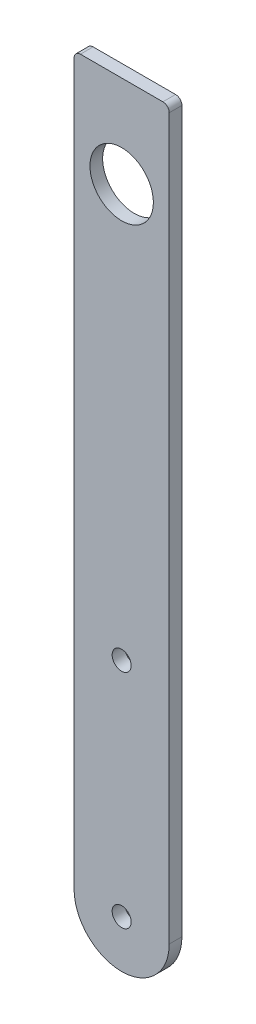
ISO-10303-21;
HEADER;
FILE_DESCRIPTION(('STEP AP214'),'2;1');
FILE_NAME('part.step','',(''),(''),'','','');
FILE_SCHEMA(('AUTOMOTIVE_DESIGN { 1 0 10303 214 1 1 1 1 }'));
ENDSEC;
DATA;
#1=APPLICATION_CONTEXT('core data for automotive mechanical design processes');
#2=APPLICATION_PROTOCOL_DEFINITION('international standard','automotive_design',2000,#1);
#3=PRODUCT_CONTEXT('',#1,'mechanical');
#4=PRODUCT('Part','Part','',(#3));
#5=PRODUCT_RELATED_PRODUCT_CATEGORY('part','',(#4));
#6=PRODUCT_DEFINITION_FORMATION('','',#4);
#7=PRODUCT_DEFINITION_CONTEXT('part definition',#1,'design');
#8=PRODUCT_DEFINITION('design','',#6,#7);
#9=PRODUCT_DEFINITION_SHAPE('','',#8);
#10=(LENGTH_UNIT() NAMED_UNIT(*) SI_UNIT(.MILLI.,.METRE.));
#11=(NAMED_UNIT(*) PLANE_ANGLE_UNIT() SI_UNIT($,.RADIAN.));
#12=(NAMED_UNIT(*) SI_UNIT($,.STERADIAN.) SOLID_ANGLE_UNIT());
#13=UNCERTAINTY_MEASURE_WITH_UNIT(LENGTH_MEASURE(1.E-05),#10,'distance_accuracy_value','');
#14=(GEOMETRIC_REPRESENTATION_CONTEXT(3) GLOBAL_UNCERTAINTY_ASSIGNED_CONTEXT((#13)) GLOBAL_UNIT_ASSIGNED_CONTEXT((#10,
#11,#12)) REPRESENTATION_CONTEXT('',''));
#15=CARTESIAN_POINT('',(0.,0.,0.));
#16=DIRECTION('',(0.,0.,1.));
#17=DIRECTION('',(1.,0.,0.));
#18=AXIS2_PLACEMENT_3D('',#15,#16,#17);
#19=CARTESIAN_POINT('',(0.,0.,2.));
#20=DIRECTION('',(-1.,0.,0.));
#21=DIRECTION('',(0.,0.,1.));
#22=AXIS2_PLACEMENT_3D('',#19,#20,#21);
#23=PLANE('',#22);
#24=DIRECTION('',(0.,1.,0.));
#25=VECTOR('',#24,1.);
#26=CARTESIAN_POINT('',(0.,0.,2.));
#27=LINE('',#26,#25);
#28=CARTESIAN_POINT('',(0.,6.5,2.));
#29=VERTEX_POINT('',#28);
#30=CARTESIAN_POINT('',(0.,120.,2.));
#31=VERTEX_POINT('',#30);
#32=EDGE_CURVE('E92',#29,#31,#27,.T.);
#33=ORIENTED_EDGE('',*,*,#32,.T.);
#34=DIRECTION('',(0.,0.,-1.));
#35=VECTOR('',#34,1.);
#36=CARTESIAN_POINT('',(0.,120.,2.));
#37=LINE('',#36,#35);
#38=CARTESIAN_POINT('',(0.,120.,0.));
#39=VERTEX_POINT('',#38);
#40=EDGE_CURVE('E11',#31,#39,#37,.T.);
#41=ORIENTED_EDGE('',*,*,#40,.T.);
#42=DIRECTION('',(0.,1.,0.));
#43=VECTOR('',#42,1.);
#44=CARTESIAN_POINT('',(0.,0.,0.));
#45=LINE('',#44,#43);
#46=CARTESIAN_POINT('',(0.,6.5,0.));
#47=VERTEX_POINT('',#46);
#48=EDGE_CURVE('E95',#47,#39,#45,.T.);
#49=ORIENTED_EDGE('',*,*,#48,.F.);
#50=DIRECTION('',(0.,0.,-1.));
#51=VECTOR('',#50,1.);
#52=CARTESIAN_POINT('',(0.,6.5,2.));
#53=LINE('',#52,#51);
#54=EDGE_CURVE('E90',#29,#47,#53,.T.);
#55=ORIENTED_EDGE('',*,*,#54,.F.);
#56=EDGE_LOOP('',(#33,#41,#49,#55));
#57=FACE_BOUND('',#56,.T.);
#58=ADVANCED_FACE('F35',(#57),#23,.T.);
#59=CARTESIAN_POINT('',(7.50000000000001,6.5,2.));
#60=DIRECTION('',(0.,0.,-1.));
#61=DIRECTION('',(-1.,0.,0.));
#62=AXIS2_PLACEMENT_3D('',#59,#60,#61);
#63=CYLINDRICAL_SURFACE('',#62,7.50000000000001);
#64=CARTESIAN_POINT('',(7.50000000000001,6.5,0.));
#65=DIRECTION('',(0.,0.,1.));
#66=DIRECTION('',(1.,0.,0.));
#67=AXIS2_PLACEMENT_3D('',#64,#65,#66);
#68=CIRCLE('',#67,7.50000000000001);
#69=CARTESIAN_POINT('',(15.,6.5,0.));
#70=VERTEX_POINT('',#69);
#71=EDGE_CURVE('E129',#47,#70,#68,.T.);
#72=ORIENTED_EDGE('',*,*,#71,.T.);
#73=DIRECTION('',(0.,0.,-1.));
#74=VECTOR('',#73,1.);
#75=CARTESIAN_POINT('',(15.,6.5,2.));
#76=LINE('',#75,#74);
#77=CARTESIAN_POINT('',(15.,6.5,2.));
#78=VERTEX_POINT('',#77);
#79=EDGE_CURVE('E100',#78,#70,#76,.T.);
#80=ORIENTED_EDGE('',*,*,#79,.F.);
#81=CARTESIAN_POINT('',(7.50000000000001,6.5,2.));
#82=DIRECTION('',(0.,0.,1.));
#83=DIRECTION('',(1.,0.,0.));
#84=AXIS2_PLACEMENT_3D('',#81,#82,#83);
#85=CIRCLE('',#84,7.50000000000001);
#86=EDGE_CURVE('E104',#29,#78,#85,.T.);
#87=ORIENTED_EDGE('',*,*,#86,.F.);
#88=ORIENTED_EDGE('',*,*,#54,.T.);
#89=EDGE_LOOP('',(#72,#80,#87,#88));
#90=FACE_BOUND('',#89,.T.);
#91=ADVANCED_FACE('F105',(#90),#63,.T.);
#92=CARTESIAN_POINT('',(15.,0.,2.));
#93=DIRECTION('',(-1.,0.,0.));
#94=DIRECTION('',(0.,-1.,0.));
#95=AXIS2_PLACEMENT_3D('',#92,#93,#94);
#96=PLANE('',#95);
#97=DIRECTION('',(0.,1.,0.));
#98=VECTOR('',#97,1.);
#99=CARTESIAN_POINT('',(15.,0.,0.));
#100=LINE('',#99,#98);
#101=CARTESIAN_POINT('',(15.,120.,0.));
#102=VERTEX_POINT('',#101);
#103=EDGE_CURVE('E131',#70,#102,#100,.T.);
#104=ORIENTED_EDGE('',*,*,#103,.T.);
#105=DIRECTION('',(0.,0.,-1.));
#106=VECTOR('',#105,1.);
#107=CARTESIAN_POINT('',(15.,120.,2.));
#108=LINE('',#107,#106);
#109=CARTESIAN_POINT('',(15.,120.,2.));
#110=VERTEX_POINT('',#109);
#111=EDGE_CURVE('E58',#102,#110,#108,.F.);
#112=ORIENTED_EDGE('',*,*,#111,.T.);
#113=DIRECTION('',(0.,1.,0.));
#114=VECTOR('',#113,1.);
#115=CARTESIAN_POINT('',(15.,0.,2.));
#116=LINE('',#115,#114);
#117=EDGE_CURVE('E107',#78,#110,#116,.T.);
#118=ORIENTED_EDGE('',*,*,#117,.F.);
#119=ORIENTED_EDGE('',*,*,#79,.T.);
#120=EDGE_LOOP('',(#104,#112,#118,#119));
#121=FACE_BOUND('',#120,.T.);
#122=ADVANCED_FACE('F156',(#121),#96,.F.);
#123=CARTESIAN_POINT('',(7.50000000000001,6.5,2.));
#124=DIRECTION('',(0.,0.,-1.));
#125=DIRECTION('',(-1.,0.,0.));
#126=AXIS2_PLACEMENT_3D('',#123,#124,#125);
#127=CYLINDRICAL_SURFACE('',#126,1.5);
#128=CARTESIAN_POINT('',(7.50000000000001,6.5,2.));
#129=DIRECTION('',(0.,0.,1.));
#130=DIRECTION('',(1.,0.,0.));
#131=AXIS2_PLACEMENT_3D('',#128,#129,#130);
#132=CIRCLE('',#131,1.5);
#133=CARTESIAN_POINT('',(9.00000000000001,6.5,2.));
#134=VERTEX_POINT('',#133);
#135=EDGE_CURVE('E110',#134,#134,#132,.T.);
#136=ORIENTED_EDGE('',*,*,#135,.T.);
#137=EDGE_LOOP('',(#136));
#138=FACE_BOUND('',#137,.T.);
#139=CARTESIAN_POINT('',(7.50000000000001,6.5,0.));
#140=DIRECTION('',(0.,0.,1.));
#141=DIRECTION('',(1.,0.,0.));
#142=AXIS2_PLACEMENT_3D('',#139,#140,#141);
#143=CIRCLE('',#142,1.5);
#144=CARTESIAN_POINT('',(9.00000000000001,6.5,0.));
#145=VERTEX_POINT('',#144);
#146=EDGE_CURVE('E124',#145,#145,#143,.T.);
#147=ORIENTED_EDGE('',*,*,#146,.F.);
#148=EDGE_LOOP('',(#147));
#149=FACE_BOUND('',#148,.T.);
#150=ADVANCED_FACE('F173',(#138,#149),#127,.F.);
#151=CARTESIAN_POINT('',(7.50000000000001,106.5,2.));
#152=DIRECTION('',(0.,0.,-1.));
#153=DIRECTION('',(-1.,0.,0.));
#154=AXIS2_PLACEMENT_3D('',#151,#152,#153);
#155=CYLINDRICAL_SURFACE('',#154,5.);
#156=CARTESIAN_POINT('',(7.50000000000001,106.5,2.));
#157=DIRECTION('',(0.,0.,1.));
#158=DIRECTION('',(1.,0.,0.));
#159=AXIS2_PLACEMENT_3D('',#156,#157,#158);
#160=CIRCLE('',#159,5.);
#161=CARTESIAN_POINT('',(12.5,106.5,2.));
#162=VERTEX_POINT('',#161);
#163=EDGE_CURVE('E113',#162,#162,#160,.T.);
#164=ORIENTED_EDGE('',*,*,#163,.T.);
#165=EDGE_LOOP('',(#164));
#166=FACE_BOUND('',#165,.T.);
#167=CARTESIAN_POINT('',(7.50000000000001,106.5,0.));
#168=DIRECTION('',(0.,0.,1.));
#169=DIRECTION('',(1.,0.,0.));
#170=AXIS2_PLACEMENT_3D('',#167,#168,#169);
#171=CIRCLE('',#170,5.);
#172=CARTESIAN_POINT('',(12.5,106.5,0.));
#173=VERTEX_POINT('',#172);
#174=EDGE_CURVE('E121',#173,#173,#171,.T.);
#175=ORIENTED_EDGE('',*,*,#174,.F.);
#176=EDGE_LOOP('',(#175));
#177=FACE_BOUND('',#176,.T.);
#178=ADVANCED_FACE('F176',(#166,#177),#155,.F.);
#179=CARTESIAN_POINT('',(0.,121.,2.));
#180=DIRECTION('',(0.,1.,0.));
#181=DIRECTION('',(0.,0.,1.));
#182=AXIS2_PLACEMENT_3D('',#179,#180,#181);
#183=PLANE('',#182);
#184=DIRECTION('',(1.,0.,0.));
#185=VECTOR('',#184,1.);
#186=CARTESIAN_POINT('',(0.,121.,2.));
#187=LINE('',#186,#185);
#188=CARTESIAN_POINT('',(1.,121.,2.));
#189=VERTEX_POINT('',#188);
#190=CARTESIAN_POINT('',(14.,121.,2.));
#191=VERTEX_POINT('',#190);
#192=EDGE_CURVE('E118',#189,#191,#187,.T.);
#193=ORIENTED_EDGE('',*,*,#192,.T.);
#194=DIRECTION('',(0.,0.,-1.));
#195=VECTOR('',#194,1.);
#196=CARTESIAN_POINT('',(14.,121.,0.));
#197=LINE('',#196,#195);
#198=CARTESIAN_POINT('',(14.,121.,0.));
#199=VERTEX_POINT('',#198);
#200=EDGE_CURVE('E138',#191,#199,#197,.T.);
#201=ORIENTED_EDGE('',*,*,#200,.T.);
#202=DIRECTION('',(1.,0.,0.));
#203=VECTOR('',#202,1.);
#204=CARTESIAN_POINT('',(0.,121.,0.));
#205=LINE('',#204,#203);
#206=CARTESIAN_POINT('',(1.,121.,0.));
#207=VERTEX_POINT('',#206);
#208=EDGE_CURVE('E133',#207,#199,#205,.T.);
#209=ORIENTED_EDGE('',*,*,#208,.F.);
#210=DIRECTION('',(0.,0.,-1.));
#211=VECTOR('',#210,1.);
#212=CARTESIAN_POINT('',(1.,121.,2.));
#213=LINE('',#212,#211);
#214=EDGE_CURVE('E99',#207,#189,#213,.F.);
#215=ORIENTED_EDGE('',*,*,#214,.T.);
#216=EDGE_LOOP('',(#193,#201,#209,#215));
#217=FACE_BOUND('',#216,.T.);
#218=ADVANCED_FACE('F150',(#217),#183,.T.);
#219=CARTESIAN_POINT('',(0.,0.,2.));
#220=DIRECTION('',(0.,0.,1.));
#221=DIRECTION('',(1.,0.,0.));
#222=AXIS2_PLACEMENT_3D('',#219,#220,#221);
#223=PLANE('',#222);
#224=CARTESIAN_POINT('',(7.50000000000001,41.5,2.));
#225=DIRECTION('',(0.,0.,1.));
#226=DIRECTION('',(1.,0.,0.));
#227=AXIS2_PLACEMENT_3D('',#224,#225,#226);
#228=CIRCLE('',#227,1.5);
#229=CARTESIAN_POINT('',(9.00000000000001,41.5,2.));
#230=VERTEX_POINT('',#229);
#231=EDGE_CURVE('E271',#230,#230,#228,.T.);
#232=ORIENTED_EDGE('',*,*,#231,.F.);
#233=EDGE_LOOP('',(#232));
#234=FACE_BOUND('',#233,.T.);
#235=ORIENTED_EDGE('',*,*,#163,.F.);
#236=EDGE_LOOP('',(#235));
#237=FACE_BOUND('',#236,.T.);
#238=ORIENTED_EDGE('',*,*,#135,.F.);
#239=EDGE_LOOP('',(#238));
#240=FACE_BOUND('',#239,.T.);
#241=ORIENTED_EDGE('',*,*,#117,.T.);
#242=CARTESIAN_POINT('',(14.,120.,2.));
#243=DIRECTION('',(0.,0.,1.));
#244=DIRECTION('',(1.,0.,0.));
#245=AXIS2_PLACEMENT_3D('',#242,#243,#244);
#246=CIRCLE('',#245,1.);
#247=EDGE_CURVE('E43',#110,#191,#246,.T.);
#248=ORIENTED_EDGE('',*,*,#247,.T.);
#249=ORIENTED_EDGE('',*,*,#192,.F.);
#250=CARTESIAN_POINT('',(1.,120.,2.));
#251=DIRECTION('',(0.,0.,1.));
#252=DIRECTION('',(1.,0.,0.));
#253=AXIS2_PLACEMENT_3D('',#250,#251,#252);
#254=CIRCLE('',#253,1.);
#255=EDGE_CURVE('E50',#189,#31,#254,.T.);
#256=ORIENTED_EDGE('',*,*,#255,.T.);
#257=ORIENTED_EDGE('',*,*,#32,.F.);
#258=ORIENTED_EDGE('',*,*,#86,.T.);
#259=EDGE_LOOP('',(#241,#248,#249,#256,#257,#258));
#260=FACE_BOUND('',#259,.T.);
#261=ADVANCED_FACE('F109',(#234,#237,#240,#260),#223,.T.);
#262=CARTESIAN_POINT('',(0.,0.,0.));
#263=DIRECTION('',(0.,0.,1.));
#264=DIRECTION('',(1.,0.,0.));
#265=AXIS2_PLACEMENT_3D('',#262,#263,#264);
#266=PLANE('',#265);
#267=CARTESIAN_POINT('',(7.50000000000001,41.5,0.));
#268=DIRECTION('',(0.,0.,1.));
#269=DIRECTION('',(1.,0.,0.));
#270=AXIS2_PLACEMENT_3D('',#267,#268,#269);
#271=CIRCLE('',#270,1.5);
#272=CARTESIAN_POINT('',(9.00000000000001,41.5,0.));
#273=VERTEX_POINT('',#272);
#274=EDGE_CURVE('E125',#273,#273,#271,.T.);
#275=ORIENTED_EDGE('',*,*,#274,.T.);
#276=EDGE_LOOP('',(#275));
#277=FACE_BOUND('',#276,.T.);
#278=ORIENTED_EDGE('',*,*,#174,.T.);
#279=EDGE_LOOP('',(#278));
#280=FACE_BOUND('',#279,.T.);
#281=ORIENTED_EDGE('',*,*,#146,.T.);
#282=EDGE_LOOP('',(#281));
#283=FACE_BOUND('',#282,.T.);
#284=ORIENTED_EDGE('',*,*,#208,.T.);
#285=CARTESIAN_POINT('',(14.,120.,0.));
#286=DIRECTION('',(0.,0.,1.));
#287=DIRECTION('',(1.,0.,0.));
#288=AXIS2_PLACEMENT_3D('',#285,#286,#287);
#289=CIRCLE('',#288,1.);
#290=EDGE_CURVE('E143',#199,#102,#289,.F.);
#291=ORIENTED_EDGE('',*,*,#290,.T.);
#292=ORIENTED_EDGE('',*,*,#103,.F.);
#293=ORIENTED_EDGE('',*,*,#71,.F.);
#294=ORIENTED_EDGE('',*,*,#48,.T.);
#295=CARTESIAN_POINT('',(1.,120.,0.));
#296=DIRECTION('',(0.,0.,1.));
#297=DIRECTION('',(1.,0.,0.));
#298=AXIS2_PLACEMENT_3D('',#295,#296,#297);
#299=CIRCLE('',#298,1.);
#300=EDGE_CURVE('E141',#39,#207,#299,.F.);
#301=ORIENTED_EDGE('',*,*,#300,.T.);
#302=EDGE_LOOP('',(#284,#291,#292,#293,#294,#301));
#303=FACE_BOUND('',#302,.T.);
#304=ADVANCED_FACE('F155',(#277,#280,#283,#303),#266,.F.);
#305=CARTESIAN_POINT('',(7.50000000000001,41.5,0.));
#306=DIRECTION('',(0.,0.,1.));
#307=DIRECTION('',(1.,0.,0.));
#308=AXIS2_PLACEMENT_3D('',#305,#306,#307);
#309=CYLINDRICAL_SURFACE('',#308,1.5);
#310=ORIENTED_EDGE('',*,*,#274,.F.);
#311=EDGE_LOOP('',(#310));
#312=FACE_BOUND('',#311,.T.);
#313=ORIENTED_EDGE('',*,*,#231,.T.);
#314=EDGE_LOOP('',(#313));
#315=FACE_BOUND('',#314,.T.);
#316=ADVANCED_FACE('F162',(#312,#315),#309,.F.);
#317=CARTESIAN_POINT('',(14.,120.,2.));
#318=DIRECTION('',(0.,0.,1.));
#319=DIRECTION('',(1.,0.,0.));
#320=AXIS2_PLACEMENT_3D('',#317,#318,#319);
#321=CYLINDRICAL_SURFACE('',#320,1.);
#322=ORIENTED_EDGE('',*,*,#247,.F.);
#323=ORIENTED_EDGE('',*,*,#111,.F.);
#324=ORIENTED_EDGE('',*,*,#290,.F.);
#325=ORIENTED_EDGE('',*,*,#200,.F.);
#326=EDGE_LOOP('',(#322,#323,#324,#325));
#327=FACE_BOUND('',#326,.T.);
#328=ADVANCED_FACE('F153',(#327),#321,.T.);
#329=CARTESIAN_POINT('',(1.,120.,2.));
#330=DIRECTION('',(0.,0.,-1.));
#331=DIRECTION('',(-1.,0.,0.));
#332=AXIS2_PLACEMENT_3D('',#329,#330,#331);
#333=CYLINDRICAL_SURFACE('',#332,1.);
#334=ORIENTED_EDGE('',*,*,#255,.F.);
#335=ORIENTED_EDGE('',*,*,#214,.F.);
#336=ORIENTED_EDGE('',*,*,#300,.F.);
#337=ORIENTED_EDGE('',*,*,#40,.F.);
#338=EDGE_LOOP('',(#334,#335,#336,#337));
#339=FACE_BOUND('',#338,.T.);
#340=ADVANCED_FACE('F37',(#339),#333,.T.);
#341=CLOSED_SHELL('',(#58,#91,#122,#150,#178,#218,#261,#304,#316,#328,#340));
#342=MANIFOLD_SOLID_BREP('B2',#341);
#343=ADVANCED_BREP_SHAPE_REPRESENTATION('',(#18,#342),#14);
#344=SHAPE_DEFINITION_REPRESENTATION(#9,#343);
ENDSEC;
END-ISO-10303-21;
